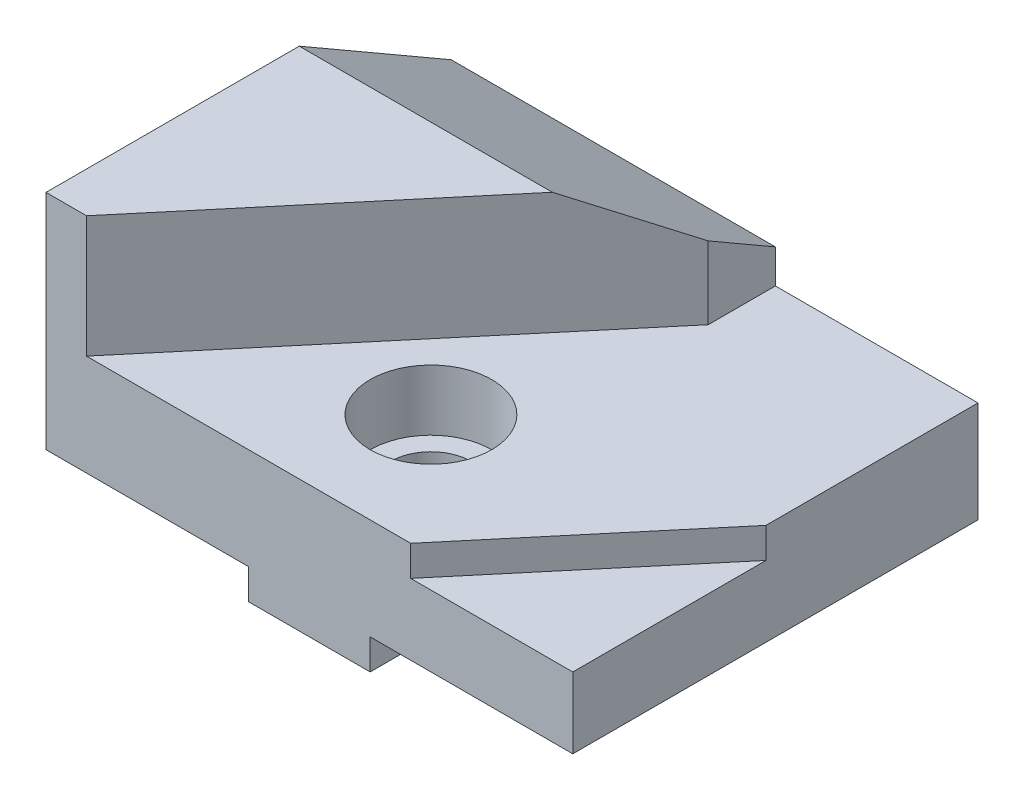
ISO-10303-21;
HEADER;
FILE_DESCRIPTION(('STEP AP214'),'2;1');
FILE_NAME('part.step','',(''),(''),'','','');
FILE_SCHEMA(('AUTOMOTIVE_DESIGN { 1 0 10303 214 1 1 1 1 }'));
ENDSEC;
DATA;
#1=APPLICATION_CONTEXT('core data for automotive mechanical design processes');
#2=APPLICATION_PROTOCOL_DEFINITION('international standard','automotive_design',2000,#1);
#3=PRODUCT_CONTEXT('',#1,'mechanical');
#4=PRODUCT('Part','Part','',(#3));
#5=PRODUCT_RELATED_PRODUCT_CATEGORY('part','',(#4));
#6=PRODUCT_DEFINITION_FORMATION('','',#4);
#7=PRODUCT_DEFINITION_CONTEXT('part definition',#1,'design');
#8=PRODUCT_DEFINITION('design','',#6,#7);
#9=PRODUCT_DEFINITION_SHAPE('','',#8);
#10=(LENGTH_UNIT() NAMED_UNIT(*) SI_UNIT(.MILLI.,.METRE.));
#11=(NAMED_UNIT(*) PLANE_ANGLE_UNIT() SI_UNIT($,.RADIAN.));
#12=(NAMED_UNIT(*) SI_UNIT($,.STERADIAN.) SOLID_ANGLE_UNIT());
#13=UNCERTAINTY_MEASURE_WITH_UNIT(LENGTH_MEASURE(1.E-05),#10,'distance_accuracy_value','');
#14=(GEOMETRIC_REPRESENTATION_CONTEXT(3) GLOBAL_UNCERTAINTY_ASSIGNED_CONTEXT((#13)) GLOBAL_UNIT_ASSIGNED_CONTEXT((#10,
#11,#12)) REPRESENTATION_CONTEXT('',''));
#15=CARTESIAN_POINT('',(0.,0.,0.));
#16=DIRECTION('',(0.,0.,1.));
#17=DIRECTION('',(1.,0.,0.));
#18=AXIS2_PLACEMENT_3D('',#15,#16,#17);
#19=CARTESIAN_POINT('',(41.275,4.7625,-63.5));
#20=DIRECTION('',(1.,0.,0.));
#21=DIRECTION('',(0.,0.,-1.));
#22=AXIS2_PLACEMENT_3D('',#19,#20,#21);
#23=PLANE('',#22);
#24=DIRECTION('',(0.,1.,0.));
#25=VECTOR('',#24,1.);
#26=CARTESIAN_POINT('',(41.275,15.875,-30.2705412518926));
#27=LINE('',#26,#25);
#28=CARTESIAN_POINT('',(41.275,15.875,-30.2705412518926));
#29=VERTEX_POINT('',#28);
#30=CARTESIAN_POINT('',(41.275,20.6375,-30.2705412518926));
#31=VERTEX_POINT('',#30);
#32=EDGE_CURVE('E58',#29,#31,#27,.T.);
#33=ORIENTED_EDGE('',*,*,#32,.F.);
#34=DIRECTION('',(0.,0.,-1.));
#35=VECTOR('',#34,1.);
#36=CARTESIAN_POINT('',(41.275,15.875,-30.2705412518926));
#37=LINE('',#36,#35);
#38=CARTESIAN_POINT('',(41.275,15.875,0.));
#39=VERTEX_POINT('',#38);
#40=EDGE_CURVE('E147',#39,#29,#37,.T.);
#41=ORIENTED_EDGE('',*,*,#40,.F.);
#42=DIRECTION('',(0.,1.,0.));
#43=VECTOR('',#42,1.);
#44=CARTESIAN_POINT('',(41.275,4.7625,0.));
#45=LINE('',#44,#43);
#46=CARTESIAN_POINT('',(41.275,4.7625,0.));
#47=VERTEX_POINT('',#46);
#48=EDGE_CURVE('E157',#47,#39,#45,.T.);
#49=ORIENTED_EDGE('',*,*,#48,.F.);
#50=DIRECTION('',(0.,0.,1.));
#51=VECTOR('',#50,1.);
#52=CARTESIAN_POINT('',(41.275,4.7625,-63.5));
#53=LINE('',#52,#51);
#54=CARTESIAN_POINT('',(41.275,4.7625,-63.5));
#55=VERTEX_POINT('',#54);
#56=EDGE_CURVE('E203',#55,#47,#53,.T.);
#57=ORIENTED_EDGE('',*,*,#56,.F.);
#58=DIRECTION('',(0.,1.,0.));
#59=VECTOR('',#58,1.);
#60=CARTESIAN_POINT('',(41.275,4.7625,-63.5));
#61=LINE('',#60,#59);
#62=CARTESIAN_POINT('',(41.275,20.6375,-63.5));
#63=VERTEX_POINT('',#62);
#64=EDGE_CURVE('E202',#55,#63,#61,.T.);
#65=ORIENTED_EDGE('',*,*,#64,.T.);
#66=DIRECTION('',(0.,0.,1.));
#67=VECTOR('',#66,1.);
#68=CARTESIAN_POINT('',(41.275,20.6375,-63.5));
#69=LINE('',#68,#67);
#70=EDGE_CURVE('E264',#63,#31,#69,.T.);
#71=ORIENTED_EDGE('',*,*,#70,.T.);
#72=EDGE_LOOP('',(#33,#41,#49,#57,#65,#71));
#73=FACE_BOUND('',#72,.T.);
#74=ADVANCED_FACE('F41',(#73),#23,.T.);
#75=CARTESIAN_POINT('',(-41.275,39.6875,-63.5));
#76=DIRECTION('',(0.,1.,0.));
#77=DIRECTION('',(0.,0.,1.));
#78=AXIS2_PLACEMENT_3D('',#75,#76,#77);
#79=PLANE('',#78);
#80=DIRECTION('',(0.642787609686544,0.,-0.766044443118975));
#81=VECTOR('',#80,1.);
#82=CARTESIAN_POINT('',(-34.925,39.6875,0.));
#83=LINE('',#82,#81);
#84=CARTESIAN_POINT('',(-34.925,39.6875,0.));
#85=VERTEX_POINT('',#84);
#86=CARTESIAN_POINT('',(-1.62323338765145,39.6875,-39.6874999999999));
#87=VERTEX_POINT('',#86);
#88=EDGE_CURVE('E168',#85,#87,#83,.T.);
#89=ORIENTED_EDGE('',*,*,#88,.T.);
#90=DIRECTION('',(-1.,0.,0.));
#91=VECTOR('',#90,1.);
#92=CARTESIAN_POINT('',(-41.275,39.6875,-39.6874999999999));
#93=LINE('',#92,#91);
#94=CARTESIAN_POINT('',(-41.275,39.6875,-39.6874999999999));
#95=VERTEX_POINT('',#94);
#96=EDGE_CURVE('E206',#87,#95,#93,.T.);
#97=ORIENTED_EDGE('',*,*,#96,.T.);
#98=DIRECTION('',(0.,0.,1.));
#99=VECTOR('',#98,1.);
#100=CARTESIAN_POINT('',(-41.275,39.6875,-63.5));
#101=LINE('',#100,#99);
#102=CARTESIAN_POINT('',(-41.275,39.6875,0.));
#103=VERTEX_POINT('',#102);
#104=EDGE_CURVE('E222',#95,#103,#101,.T.);
#105=ORIENTED_EDGE('',*,*,#104,.T.);
#106=DIRECTION('',(-1.,0.,0.));
#107=VECTOR('',#106,1.);
#108=CARTESIAN_POINT('',(-41.275,39.6875,0.));
#109=LINE('',#108,#107);
#110=EDGE_CURVE('E167',#85,#103,#109,.T.);
#111=ORIENTED_EDGE('',*,*,#110,.F.);
#112=EDGE_LOOP('',(#89,#97,#105,#111));
#113=FACE_BOUND('',#112,.T.);
#114=ADVANCED_FACE('F334',(#113),#79,.T.);
#115=CARTESIAN_POINT('',(0.,0.,0.));
#116=DIRECTION('',(0.,0.,-1.));
#117=DIRECTION('',(-1.,0.,0.));
#118=AXIS2_PLACEMENT_3D('',#115,#116,#117);
#119=PLANE('',#118);
#120=DIRECTION('',(1.,0.,0.));
#121=VECTOR('',#120,1.);
#122=CARTESIAN_POINT('',(41.275,15.875,0.));
#123=LINE('',#122,#121);
#124=CARTESIAN_POINT('',(15.875,15.875,0.));
#125=VERTEX_POINT('',#124);
#126=EDGE_CURVE('E144',#125,#39,#123,.T.);
#127=ORIENTED_EDGE('',*,*,#126,.F.);
#128=DIRECTION('',(0.,1.,0.));
#129=VECTOR('',#128,1.);
#130=CARTESIAN_POINT('',(15.875,15.875,0.));
#131=LINE('',#130,#129);
#132=CARTESIAN_POINT('',(15.875,20.6375,0.));
#133=VERTEX_POINT('',#132);
#134=EDGE_CURVE('E270',#125,#133,#131,.T.);
#135=ORIENTED_EDGE('',*,*,#134,.T.);
#136=DIRECTION('',(-1.,0.,0.));
#137=VECTOR('',#136,1.);
#138=CARTESIAN_POINT('',(-41.275,20.6375,0.));
#139=LINE('',#138,#137);
#140=CARTESIAN_POINT('',(-34.925,20.6375,0.));
#141=VERTEX_POINT('',#140);
#142=EDGE_CURVE('E267',#133,#141,#139,.T.);
#143=ORIENTED_EDGE('',*,*,#142,.T.);
#144=DIRECTION('',(0.,-1.,0.));
#145=VECTOR('',#144,1.);
#146=CARTESIAN_POINT('',(-34.925,222.660442715341,0.));
#147=LINE('',#146,#145);
#148=EDGE_CURVE('E276',#85,#141,#147,.T.);
#149=ORIENTED_EDGE('',*,*,#148,.F.);
#150=ORIENTED_EDGE('',*,*,#110,.T.);
#151=DIRECTION('',(0.,-1.,0.));
#152=VECTOR('',#151,1.);
#153=CARTESIAN_POINT('',(-41.275,4.7625,0.));
#154=LINE('',#153,#152);
#155=CARTESIAN_POINT('',(-41.275,4.7625,0.));
#156=VERTEX_POINT('',#155);
#157=EDGE_CURVE('E173',#103,#156,#154,.T.);
#158=ORIENTED_EDGE('',*,*,#157,.T.);
#159=DIRECTION('',(1.,0.,0.));
#160=VECTOR('',#159,1.);
#161=CARTESIAN_POINT('',(-41.275,4.7625,0.));
#162=LINE('',#161,#160);
#163=CARTESIAN_POINT('',(-9.525,4.7625,0.));
#164=VERTEX_POINT('',#163);
#165=EDGE_CURVE('E185',#156,#164,#162,.T.);
#166=ORIENTED_EDGE('',*,*,#165,.T.);
#167=DIRECTION('',(0.,-1.,0.));
#168=VECTOR('',#167,1.);
#169=CARTESIAN_POINT('',(-9.525,0.,0.));
#170=LINE('',#169,#168);
#171=CARTESIAN_POINT('',(-9.525,0.,0.));
#172=VERTEX_POINT('',#171);
#173=EDGE_CURVE('E189',#164,#172,#170,.T.);
#174=ORIENTED_EDGE('',*,*,#173,.T.);
#175=DIRECTION('',(1.,0.,0.));
#176=VECTOR('',#175,1.);
#177=CARTESIAN_POINT('',(-9.525,0.,0.));
#178=LINE('',#177,#176);
#179=CARTESIAN_POINT('',(9.525,0.,0.));
#180=VERTEX_POINT('',#179);
#181=EDGE_CURVE('E193',#172,#180,#178,.T.);
#182=ORIENTED_EDGE('',*,*,#181,.T.);
#183=DIRECTION('',(0.,1.,0.));
#184=VECTOR('',#183,1.);
#185=CARTESIAN_POINT('',(9.525,0.,0.));
#186=LINE('',#185,#184);
#187=CARTESIAN_POINT('',(9.525,4.7625,0.));
#188=VERTEX_POINT('',#187);
#189=EDGE_CURVE('E197',#180,#188,#186,.T.);
#190=ORIENTED_EDGE('',*,*,#189,.T.);
#191=DIRECTION('',(1.,0.,0.));
#192=VECTOR('',#191,1.);
#193=CARTESIAN_POINT('',(41.275,4.7625,0.));
#194=LINE('',#193,#192);
#195=EDGE_CURVE('E165',#188,#47,#194,.T.);
#196=ORIENTED_EDGE('',*,*,#195,.T.);
#197=ORIENTED_EDGE('',*,*,#48,.T.);
#198=EDGE_LOOP('',(#127,#135,#143,#149,#150,#158,#166,#174,#182,#190,#196,#197));
#199=FACE_BOUND('',#198,.T.);
#200=ADVANCED_FACE('F162',(#199),#119,.F.);
#201=CARTESIAN_POINT('',(0.,0.,-63.5));
#202=DIRECTION('',(0.,0.,-1.));
#203=DIRECTION('',(-1.,0.,0.));
#204=AXIS2_PLACEMENT_3D('',#201,#202,#203);
#205=PLANE('',#204);
#206=DIRECTION('',(0.,-1.,0.));
#207=VECTOR('',#206,1.);
#208=CARTESIAN_POINT('',(-41.275,4.7625,-63.5));
#209=LINE('',#208,#207);
#210=CARTESIAN_POINT('',(-41.275,25.939346714922,-63.5));
#211=VERTEX_POINT('',#210);
#212=CARTESIAN_POINT('',(-41.275,4.7625,-63.5));
#213=VERTEX_POINT('',#212);
#214=EDGE_CURVE('E251',#211,#213,#209,.T.);
#215=ORIENTED_EDGE('',*,*,#214,.F.);
#216=DIRECTION('',(1.,0.,0.));
#217=VECTOR('',#216,1.);
#218=CARTESIAN_POINT('',(0.,25.939346714922,-63.5));
#219=LINE('',#218,#217);
#220=CARTESIAN_POINT('',(9.525,25.939346714922,-63.5));
#221=VERTEX_POINT('',#220);
#222=EDGE_CURVE('E231',#211,#221,#219,.T.);
#223=ORIENTED_EDGE('',*,*,#222,.T.);
#224=DIRECTION('',(0.,-1.,0.));
#225=VECTOR('',#224,1.);
#226=CARTESIAN_POINT('',(9.525,222.660442715341,-63.5));
#227=LINE('',#226,#225);
#228=CARTESIAN_POINT('',(9.525,20.6375,-63.5));
#229=VERTEX_POINT('',#228);
#230=EDGE_CURVE('E273',#221,#229,#227,.T.);
#231=ORIENTED_EDGE('',*,*,#230,.T.);
#232=DIRECTION('',(-1.,0.,0.));
#233=VECTOR('',#232,1.);
#234=CARTESIAN_POINT('',(-41.275,20.6375,-63.5));
#235=LINE('',#234,#233);
#236=EDGE_CURVE('E259',#63,#229,#235,.T.);
#237=ORIENTED_EDGE('',*,*,#236,.F.);
#238=ORIENTED_EDGE('',*,*,#64,.F.);
#239=DIRECTION('',(1.,0.,0.));
#240=VECTOR('',#239,1.);
#241=CARTESIAN_POINT('',(41.275,4.7625,-63.5));
#242=LINE('',#241,#240);
#243=CARTESIAN_POINT('',(9.525,4.7625,-63.5));
#244=VERTEX_POINT('',#243);
#245=EDGE_CURVE('E179',#244,#55,#242,.T.);
#246=ORIENTED_EDGE('',*,*,#245,.F.);
#247=DIRECTION('',(0.,1.,0.));
#248=VECTOR('',#247,1.);
#249=CARTESIAN_POINT('',(9.525,0.,-63.5));
#250=LINE('',#249,#248);
#251=CARTESIAN_POINT('',(9.525,0.,-63.5));
#252=VERTEX_POINT('',#251);
#253=EDGE_CURVE('E237',#252,#244,#250,.T.);
#254=ORIENTED_EDGE('',*,*,#253,.F.);
#255=DIRECTION('',(1.,0.,0.));
#256=VECTOR('',#255,1.);
#257=CARTESIAN_POINT('',(-9.525,0.,-63.5));
#258=LINE('',#257,#256);
#259=CARTESIAN_POINT('',(-9.525,0.,-63.5));
#260=VERTEX_POINT('',#259);
#261=EDGE_CURVE('E240',#260,#252,#258,.T.);
#262=ORIENTED_EDGE('',*,*,#261,.F.);
#263=DIRECTION('',(0.,-1.,0.));
#264=VECTOR('',#263,1.);
#265=CARTESIAN_POINT('',(-9.525,0.,-63.5));
#266=LINE('',#265,#264);
#267=CARTESIAN_POINT('',(-9.525,4.7625,-63.5));
#268=VERTEX_POINT('',#267);
#269=EDGE_CURVE('E243',#268,#260,#266,.T.);
#270=ORIENTED_EDGE('',*,*,#269,.F.);
#271=DIRECTION('',(1.,0.,0.));
#272=VECTOR('',#271,1.);
#273=CARTESIAN_POINT('',(-41.275,4.7625,-63.5));
#274=LINE('',#273,#272);
#275=EDGE_CURVE('E247',#213,#268,#274,.T.);
#276=ORIENTED_EDGE('',*,*,#275,.F.);
#277=EDGE_LOOP('',(#215,#223,#231,#237,#238,#246,#254,#262,#270,#276));
#278=FACE_BOUND('',#277,.T.);
#279=ADVANCED_FACE('F358',(#278),#205,.T.);
#280=CARTESIAN_POINT('',(41.275,4.7625,-63.5));
#281=DIRECTION('',(0.,-1.,0.));
#282=DIRECTION('',(1.,0.,0.));
#283=AXIS2_PLACEMENT_3D('',#280,#281,#282);
#284=PLANE('',#283);
#285=ORIENTED_EDGE('',*,*,#195,.F.);
#286=DIRECTION('',(0.,0.,1.));
#287=VECTOR('',#286,1.);
#288=CARTESIAN_POINT('',(9.525,4.7625,-63.5));
#289=LINE('',#288,#287);
#290=EDGE_CURVE('E207',#244,#188,#289,.T.);
#291=ORIENTED_EDGE('',*,*,#290,.F.);
#292=ORIENTED_EDGE('',*,*,#245,.T.);
#293=ORIENTED_EDGE('',*,*,#56,.T.);
#294=EDGE_LOOP('',(#285,#291,#292,#293));
#295=FACE_BOUND('',#294,.T.);
#296=ADVANCED_FACE('F355',(#295),#284,.T.);
#297=CARTESIAN_POINT('',(9.525,0.,-63.5));
#298=DIRECTION('',(1.,0.,0.));
#299=DIRECTION('',(0.,1.,0.));
#300=AXIS2_PLACEMENT_3D('',#297,#298,#299);
#301=PLANE('',#300);
#302=ORIENTED_EDGE('',*,*,#189,.F.);
#303=DIRECTION('',(0.,0.,1.));
#304=VECTOR('',#303,1.);
#305=CARTESIAN_POINT('',(9.525,0.,-63.5));
#306=LINE('',#305,#304);
#307=EDGE_CURVE('E210',#252,#180,#306,.T.);
#308=ORIENTED_EDGE('',*,*,#307,.F.);
#309=ORIENTED_EDGE('',*,*,#253,.T.);
#310=ORIENTED_EDGE('',*,*,#290,.T.);
#311=EDGE_LOOP('',(#302,#308,#309,#310));
#312=FACE_BOUND('',#311,.T.);
#313=ADVANCED_FACE('F360',(#312),#301,.T.);
#314=CARTESIAN_POINT('',(-9.525,0.,-63.5));
#315=DIRECTION('',(0.,-1.,0.));
#316=DIRECTION('',(1.,0.,0.));
#317=AXIS2_PLACEMENT_3D('',#314,#315,#316);
#318=PLANE('',#317);
#319=CARTESIAN_POINT('',(0.,0.,-19.05));
#320=DIRECTION('',(0.,1.,0.));
#321=DIRECTION('',(0.,0.,1.));
#322=AXIS2_PLACEMENT_3D('',#319,#320,#321);
#323=CIRCLE('',#322,6.35);
#324=CARTESIAN_POINT('',(0.,0.,-12.7));
#325=VERTEX_POINT('',#324);
#326=EDGE_CURVE('E293',#325,#325,#323,.T.);
#327=ORIENTED_EDGE('',*,*,#326,.T.);
#328=EDGE_LOOP('',(#327));
#329=FACE_BOUND('',#328,.T.);
#330=ORIENTED_EDGE('',*,*,#181,.F.);
#331=DIRECTION('',(0.,0.,1.));
#332=VECTOR('',#331,1.);
#333=CARTESIAN_POINT('',(-9.525,0.,-63.5));
#334=LINE('',#333,#332);
#335=EDGE_CURVE('E213',#260,#172,#334,.T.);
#336=ORIENTED_EDGE('',*,*,#335,.F.);
#337=ORIENTED_EDGE('',*,*,#261,.T.);
#338=ORIENTED_EDGE('',*,*,#307,.T.);
#339=EDGE_LOOP('',(#330,#336,#337,#338));
#340=FACE_BOUND('',#339,.T.);
#341=ADVANCED_FACE('F351',(#329,#340),#318,.T.);
#342=CARTESIAN_POINT('',(-9.525,0.,-63.5));
#343=DIRECTION('',(-1.,0.,0.));
#344=DIRECTION('',(0.,0.,1.));
#345=AXIS2_PLACEMENT_3D('',#342,#343,#344);
#346=PLANE('',#345);
#347=ORIENTED_EDGE('',*,*,#173,.F.);
#348=DIRECTION('',(0.,0.,1.));
#349=VECTOR('',#348,1.);
#350=CARTESIAN_POINT('',(-9.525,4.7625,-63.5));
#351=LINE('',#350,#349);
#352=EDGE_CURVE('E216',#268,#164,#351,.T.);
#353=ORIENTED_EDGE('',*,*,#352,.F.);
#354=ORIENTED_EDGE('',*,*,#269,.T.);
#355=ORIENTED_EDGE('',*,*,#335,.T.);
#356=EDGE_LOOP('',(#347,#353,#354,#355));
#357=FACE_BOUND('',#356,.T.);
#358=ADVANCED_FACE('F347',(#357),#346,.T.);
#359=CARTESIAN_POINT('',(-41.275,4.7625,-63.5));
#360=DIRECTION('',(0.,-1.,0.));
#361=DIRECTION('',(0.,0.,-1.));
#362=AXIS2_PLACEMENT_3D('',#359,#360,#361);
#363=PLANE('',#362);
#364=ORIENTED_EDGE('',*,*,#165,.F.);
#365=DIRECTION('',(0.,0.,1.));
#366=VECTOR('',#365,1.);
#367=CARTESIAN_POINT('',(-41.275,4.7625,-63.5));
#368=LINE('',#367,#366);
#369=EDGE_CURVE('E219',#213,#156,#368,.T.);
#370=ORIENTED_EDGE('',*,*,#369,.F.);
#371=ORIENTED_EDGE('',*,*,#275,.T.);
#372=ORIENTED_EDGE('',*,*,#352,.T.);
#373=EDGE_LOOP('',(#364,#370,#371,#372));
#374=FACE_BOUND('',#373,.T.);
#375=ADVANCED_FACE('F343',(#374),#363,.T.);
#376=CARTESIAN_POINT('',(-41.275,4.7625,-63.5));
#377=DIRECTION('',(-1.,0.,0.));
#378=DIRECTION('',(0.,0.,1.));
#379=AXIS2_PLACEMENT_3D('',#376,#377,#378);
#380=PLANE('',#379);
#381=ORIENTED_EDGE('',*,*,#104,.F.);
#382=DIRECTION('',(0.,0.499999999999998,0.86602540378444));
#383=VECTOR('',#382,1.);
#384=CARTESIAN_POINT('',(-41.275,20.6451350361916,-72.6698436135857));
#385=LINE('',#384,#383);
#386=EDGE_CURVE('E228',#95,#211,#385,.F.);
#387=ORIENTED_EDGE('',*,*,#386,.T.);
#388=ORIENTED_EDGE('',*,*,#214,.T.);
#389=ORIENTED_EDGE('',*,*,#369,.T.);
#390=ORIENTED_EDGE('',*,*,#157,.F.);
#391=EDGE_LOOP('',(#381,#387,#388,#389,#390));
#392=FACE_BOUND('',#391,.T.);
#393=ADVANCED_FACE('F337',(#392),#380,.T.);
#394=CARTESIAN_POINT('',(9.525,222.660442715341,-52.973447190812));
#395=DIRECTION('',(-1.,0.,0.));
#396=DIRECTION('',(0.,0.,1.));
#397=AXIS2_PLACEMENT_3D('',#394,#395,#396);
#398=PLANE('',#397);
#399=ORIENTED_EDGE('',*,*,#230,.F.);
#400=DIRECTION('',(0.,-0.499999999999998,-0.86602540378444));
#401=VECTOR('',#400,1.);
#402=CARTESIAN_POINT('',(9.525,39.6875,-39.6874999999999));
#403=LINE('',#402,#401);
#404=CARTESIAN_POINT('',(9.525,32.0168548129455,-52.973447190812));
#405=VERTEX_POINT('',#404);
#406=EDGE_CURVE('E51',#221,#405,#403,.F.);
#407=ORIENTED_EDGE('',*,*,#406,.T.);
#408=DIRECTION('',(0.,-1.,0.));
#409=VECTOR('',#408,1.);
#410=CARTESIAN_POINT('',(9.525,222.660442715341,-52.973447190812));
#411=LINE('',#410,#409);
#412=CARTESIAN_POINT('',(9.525,20.6375,-52.973447190812));
#413=VERTEX_POINT('',#412);
#414=EDGE_CURVE('E176',#405,#413,#411,.T.);
#415=ORIENTED_EDGE('',*,*,#414,.T.);
#416=DIRECTION('',(0.,0.,-1.));
#417=VECTOR('',#416,1.);
#418=CARTESIAN_POINT('',(9.525,20.6375,-52.973447190812));
#419=LINE('',#418,#417);
#420=EDGE_CURVE('E280',#413,#229,#419,.T.);
#421=ORIENTED_EDGE('',*,*,#420,.T.);
#422=EDGE_LOOP('',(#399,#407,#415,#421));
#423=FACE_BOUND('',#422,.T.);
#424=ADVANCED_FACE('F327',(#423),#398,.F.);
#425=CARTESIAN_POINT('',(-34.925,222.660442715341,0.));
#426=DIRECTION('',(-0.766044443118974,0.,-0.642787609686543));
#427=DIRECTION('',(-0.642787609686544,0.,0.766044443118975));
#428=AXIS2_PLACEMENT_3D('',#425,#426,#427);
#429=PLANE('',#428);
#430=ORIENTED_EDGE('',*,*,#414,.F.);
#431=DIRECTION('',(0.58785888315256,-0.404481746652002,-0.700582935935475));
#432=VECTOR('',#431,1.);
#433=CARTESIAN_POINT('',(-15.3260142269106,49.1158252098357,-23.3571617062818));
#434=LINE('',#433,#432);
#435=EDGE_CURVE('E11',#405,#87,#434,.F.);
#436=ORIENTED_EDGE('',*,*,#435,.T.);
#437=ORIENTED_EDGE('',*,*,#88,.F.);
#438=ORIENTED_EDGE('',*,*,#148,.T.);
#439=DIRECTION('',(0.642787609686544,0.,-0.766044443118975));
#440=VECTOR('',#439,1.);
#441=CARTESIAN_POINT('',(-34.925,20.6375,0.));
#442=LINE('',#441,#440);
#443=EDGE_CURVE('E263',#141,#413,#442,.T.);
#444=ORIENTED_EDGE('',*,*,#443,.T.);
#445=EDGE_LOOP('',(#430,#436,#437,#438,#444));
#446=FACE_BOUND('',#445,.T.);
#447=ADVANCED_FACE('F317',(#446),#429,.F.);
#448=CARTESIAN_POINT('',(-41.275,20.6375,-63.5));
#449=DIRECTION('',(0.,1.,0.));
#450=DIRECTION('',(0.,0.,1.));
#451=AXIS2_PLACEMENT_3D('',#448,#449,#450);
#452=PLANE('',#451);
#453=CARTESIAN_POINT('',(0.,20.6375,-19.05));
#454=DIRECTION('',(0.,1.,0.));
#455=DIRECTION('',(0.,0.,1.));
#456=AXIS2_PLACEMENT_3D('',#453,#454,#455);
#457=CIRCLE('',#456,9.525);
#458=CARTESIAN_POINT('',(0.,20.6375,-9.525));
#459=VERTEX_POINT('',#458);
#460=EDGE_CURVE('E307',#459,#459,#457,.T.);
#461=ORIENTED_EDGE('',*,*,#460,.F.);
#462=EDGE_LOOP('',(#461));
#463=FACE_BOUND('',#462,.T.);
#464=DIRECTION('',(-0.642787609686543,0.,0.766044443118974));
#465=VECTOR('',#464,1.);
#466=CARTESIAN_POINT('',(15.875,20.6375,0.));
#467=LINE('',#466,#465);
#468=EDGE_CURVE('E153',#31,#133,#467,.T.);
#469=ORIENTED_EDGE('',*,*,#468,.F.);
#470=ORIENTED_EDGE('',*,*,#70,.F.);
#471=ORIENTED_EDGE('',*,*,#236,.T.);
#472=ORIENTED_EDGE('',*,*,#420,.F.);
#473=ORIENTED_EDGE('',*,*,#443,.F.);
#474=ORIENTED_EDGE('',*,*,#142,.F.);
#475=EDGE_LOOP('',(#469,#470,#471,#472,#473,#474));
#476=FACE_BOUND('',#475,.T.);
#477=ADVANCED_FACE('F314',(#463,#476),#452,.T.);
#478=CARTESIAN_POINT('',(-41.275,39.6875,-39.6874999999999));
#479=DIRECTION('',(0.,-0.86602540378444,0.499999999999998));
#480=DIRECTION('',(-1.,0.,0.));
#481=AXIS2_PLACEMENT_3D('',#478,#479,#480);
#482=PLANE('',#481);
#483=ORIENTED_EDGE('',*,*,#406,.F.);
#484=ORIENTED_EDGE('',*,*,#222,.F.);
#485=ORIENTED_EDGE('',*,*,#386,.F.);
#486=ORIENTED_EDGE('',*,*,#96,.F.);
#487=ORIENTED_EDGE('',*,*,#435,.F.);
#488=EDGE_LOOP('',(#483,#484,#485,#486,#487));
#489=FACE_BOUND('',#488,.T.);
#490=ADVANCED_FACE('F44',(#489),#482,.F.);
#491=CARTESIAN_POINT('',(15.875,15.875,0.));
#492=DIRECTION('',(-0.766044443118975,0.,-0.642787609686544));
#493=DIRECTION('',(-0.642787609686543,0.,0.766044443118974));
#494=AXIS2_PLACEMENT_3D('',#491,#492,#493);
#495=PLANE('',#494);
#496=ORIENTED_EDGE('',*,*,#468,.T.);
#497=ORIENTED_EDGE('',*,*,#134,.F.);
#498=DIRECTION('',(-0.642787609686543,0.,0.766044443118974));
#499=VECTOR('',#498,1.);
#500=CARTESIAN_POINT('',(15.875,15.875,0.));
#501=LINE('',#500,#499);
#502=EDGE_CURVE('E148',#29,#125,#501,.T.);
#503=ORIENTED_EDGE('',*,*,#502,.F.);
#504=ORIENTED_EDGE('',*,*,#32,.T.);
#505=EDGE_LOOP('',(#496,#497,#503,#504));
#506=FACE_BOUND('',#505,.T.);
#507=ADVANCED_FACE('F322',(#506),#495,.F.);
#508=CARTESIAN_POINT('',(0.,15.875,0.));
#509=DIRECTION('',(0.,1.,0.));
#510=DIRECTION('',(0.,0.,1.));
#511=AXIS2_PLACEMENT_3D('',#508,#509,#510);
#512=PLANE('',#511);
#513=ORIENTED_EDGE('',*,*,#126,.T.);
#514=ORIENTED_EDGE('',*,*,#40,.T.);
#515=ORIENTED_EDGE('',*,*,#502,.T.);
#516=EDGE_LOOP('',(#513,#514,#515));
#517=FACE_BOUND('',#516,.T.);
#518=ADVANCED_FACE('F146',(#517),#512,.T.);
#519=CARTESIAN_POINT('',(0.,20.6375,-19.05));
#520=DIRECTION('',(0.,1.,0.));
#521=DIRECTION('',(0.,0.,1.));
#522=AXIS2_PLACEMENT_3D('',#519,#520,#521);
#523=CYLINDRICAL_SURFACE('',#522,6.35);
#524=ORIENTED_EDGE('',*,*,#326,.F.);
#525=EDGE_LOOP('',(#524));
#526=FACE_BOUND('',#525,.T.);
#527=CARTESIAN_POINT('',(0.,11.1125,-19.05));
#528=DIRECTION('',(0.,1.,0.));
#529=DIRECTION('',(0.,0.,1.));
#530=AXIS2_PLACEMENT_3D('',#527,#528,#529);
#531=CIRCLE('',#530,6.35);
#532=CARTESIAN_POINT('',(0.,11.1125,-12.7));
#533=VERTEX_POINT('',#532);
#534=EDGE_CURVE('E299',#533,#533,#531,.T.);
#535=ORIENTED_EDGE('',*,*,#534,.T.);
#536=EDGE_LOOP('',(#535));
#537=FACE_BOUND('',#536,.T.);
#538=ADVANCED_FACE('F430',(#526,#537),#523,.F.);
#539=CARTESIAN_POINT('',(6.35,11.1125,-19.05));
#540=DIRECTION('',(0.,-1.,0.));
#541=DIRECTION('',(0.,0.,-1.));
#542=AXIS2_PLACEMENT_3D('',#539,#540,#541);
#543=PLANE('',#542);
#544=ORIENTED_EDGE('',*,*,#534,.F.);
#545=EDGE_LOOP('',(#544));
#546=FACE_BOUND('',#545,.T.);
#547=CARTESIAN_POINT('',(0.,11.1125,-19.05));
#548=DIRECTION('',(0.,1.,0.));
#549=DIRECTION('',(0.,0.,1.));
#550=AXIS2_PLACEMENT_3D('',#547,#548,#549);
#551=CIRCLE('',#550,9.525);
#552=CARTESIAN_POINT('',(0.,11.1125,-9.52500000000001));
#553=VERTEX_POINT('',#552);
#554=EDGE_CURVE('E303',#553,#553,#551,.T.);
#555=ORIENTED_EDGE('',*,*,#554,.T.);
#556=EDGE_LOOP('',(#555));
#557=FACE_BOUND('',#556,.T.);
#558=ADVANCED_FACE('F436',(#546,#557),#543,.F.);
#559=CARTESIAN_POINT('',(0.,20.6375,-19.05));
#560=DIRECTION('',(0.,1.,0.));
#561=DIRECTION('',(0.,0.,1.));
#562=AXIS2_PLACEMENT_3D('',#559,#560,#561);
#563=CYLINDRICAL_SURFACE('',#562,9.525);
#564=ORIENTED_EDGE('',*,*,#554,.F.);
#565=EDGE_LOOP('',(#564));
#566=FACE_BOUND('',#565,.T.);
#567=ORIENTED_EDGE('',*,*,#460,.T.);
#568=EDGE_LOOP('',(#567));
#569=FACE_BOUND('',#568,.T.);
#570=ADVANCED_FACE('F312',(#566,#569),#563,.F.);
#571=CLOSED_SHELL('',(#74,#114,#200,#279,#296,#313,#341,#358,#375,#393,#424,#447,#477,#490,#507,
#518,#538,#558,#570));
#572=MANIFOLD_SOLID_BREP('B2',#571);
#573=ADVANCED_BREP_SHAPE_REPRESENTATION('',(#18,#572),#14);
#574=SHAPE_DEFINITION_REPRESENTATION(#9,#573);
ENDSEC;
END-ISO-10303-21;
